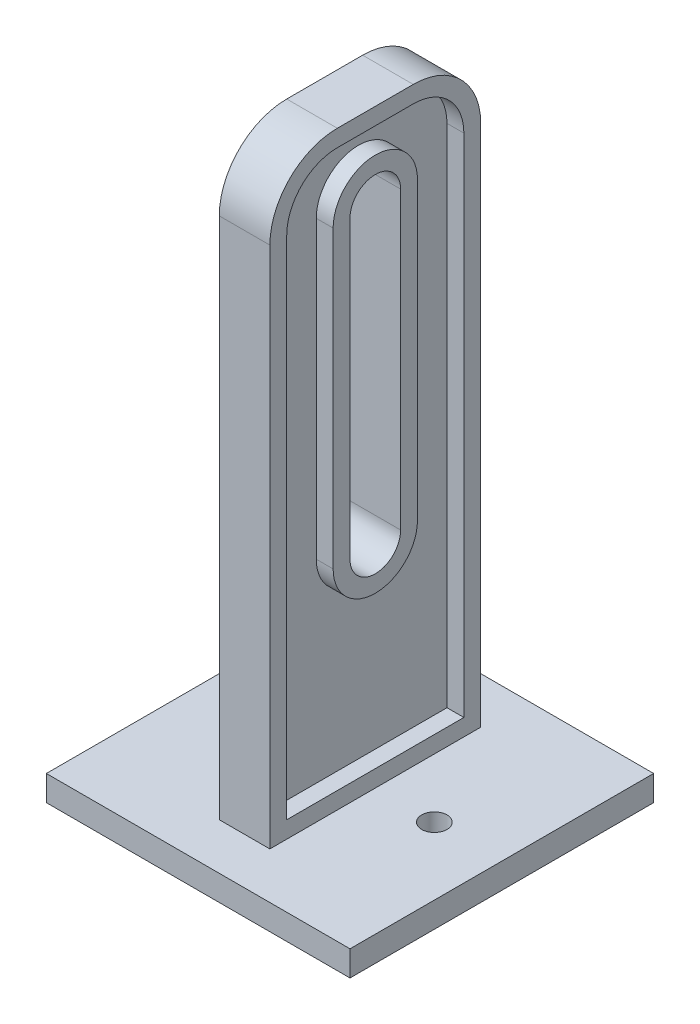
ISO-10303-21;
HEADER;
FILE_DESCRIPTION(('STEP AP214'),'2;1');
FILE_NAME('part.step','',(''),(''),'','','');
FILE_SCHEMA(('AUTOMOTIVE_DESIGN { 1 0 10303 214 1 1 1 1 }'));
ENDSEC;
DATA;
#1=APPLICATION_CONTEXT('core data for automotive mechanical design processes');
#2=APPLICATION_PROTOCOL_DEFINITION('international standard','automotive_design',2000,#1);
#3=PRODUCT_CONTEXT('',#1,'mechanical');
#4=PRODUCT('Part','Part','',(#3));
#5=PRODUCT_RELATED_PRODUCT_CATEGORY('part','',(#4));
#6=PRODUCT_DEFINITION_FORMATION('','',#4);
#7=PRODUCT_DEFINITION_CONTEXT('part definition',#1,'design');
#8=PRODUCT_DEFINITION('design','',#6,#7);
#9=PRODUCT_DEFINITION_SHAPE('','',#8);
#10=(LENGTH_UNIT() NAMED_UNIT(*) SI_UNIT(.MILLI.,.METRE.));
#11=(NAMED_UNIT(*) PLANE_ANGLE_UNIT() SI_UNIT($,.RADIAN.));
#12=(NAMED_UNIT(*) SI_UNIT($,.STERADIAN.) SOLID_ANGLE_UNIT());
#13=UNCERTAINTY_MEASURE_WITH_UNIT(LENGTH_MEASURE(1.E-05),#10,'distance_accuracy_value','');
#14=(GEOMETRIC_REPRESENTATION_CONTEXT(3) GLOBAL_UNCERTAINTY_ASSIGNED_CONTEXT((#13)) GLOBAL_UNIT_ASSIGNED_CONTEXT((#10,
#11,#12)) REPRESENTATION_CONTEXT('',''));
#15=CARTESIAN_POINT('',(0.,0.,0.));
#16=DIRECTION('',(0.,0.,1.));
#17=DIRECTION('',(1.,0.,0.));
#18=AXIS2_PLACEMENT_3D('',#15,#16,#17);
#19=CARTESIAN_POINT('',(3.,73.,12.5));
#20=DIRECTION('',(-1.,0.,0.));
#21=DIRECTION('',(0.,0.,1.));
#22=AXIS2_PLACEMENT_3D('',#19,#20,#21);
#23=PLANE('',#22);
#24=DIRECTION('',(0.,1.,0.));
#25=VECTOR('',#24,1.);
#26=CARTESIAN_POINT('',(3.,28.,-3.00000000000001));
#27=LINE('',#26,#25);
#28=CARTESIAN_POINT('',(3.,28.,-3.00000000000001));
#29=VERTEX_POINT('',#28);
#30=CARTESIAN_POINT('',(3.,63.,-3.));
#31=VERTEX_POINT('',#30);
#32=EDGE_CURVE('E319',#29,#31,#27,.T.);
#33=ORIENTED_EDGE('',*,*,#32,.F.);
#34=CARTESIAN_POINT('',(3.,28.,0.));
#35=DIRECTION('',(1.,0.,0.));
#36=DIRECTION('',(0.,0.,-1.));
#37=AXIS2_PLACEMENT_3D('',#34,#35,#36);
#38=CIRCLE('',#37,3.);
#39=CARTESIAN_POINT('',(3.,28.,2.99999999999999));
#40=VERTEX_POINT('',#39);
#41=EDGE_CURVE('E302',#40,#29,#38,.T.);
#42=ORIENTED_EDGE('',*,*,#41,.F.);
#43=DIRECTION('',(0.,-1.,0.));
#44=VECTOR('',#43,1.);
#45=CARTESIAN_POINT('',(3.,28.,2.99999999999999));
#46=LINE('',#45,#44);
#47=CARTESIAN_POINT('',(3.,63.,3.));
#48=VERTEX_POINT('',#47);
#49=EDGE_CURVE('E327',#48,#40,#46,.T.);
#50=ORIENTED_EDGE('',*,*,#49,.F.);
#51=CARTESIAN_POINT('',(3.,63.,0.));
#52=DIRECTION('',(1.,0.,0.));
#53=DIRECTION('',(0.,0.,-1.));
#54=AXIS2_PLACEMENT_3D('',#51,#52,#53);
#55=CIRCLE('',#54,3.);
#56=EDGE_CURVE('E323',#31,#48,#55,.T.);
#57=ORIENTED_EDGE('',*,*,#56,.F.);
#58=EDGE_LOOP('',(#33,#42,#50,#57));
#59=FACE_BOUND('',#58,.T.);
#60=CARTESIAN_POINT('',(3.,63.,0.));
#61=DIRECTION('',(1.,0.,0.));
#62=DIRECTION('',(0.,0.,-1.));
#63=AXIS2_PLACEMENT_3D('',#60,#61,#62);
#64=CIRCLE('',#63,5.);
#65=CARTESIAN_POINT('',(3.,63.,-5.));
#66=VERTEX_POINT('',#65);
#67=CARTESIAN_POINT('',(3.,63.,5.));
#68=VERTEX_POINT('',#67);
#69=EDGE_CURVE('E238',#66,#68,#64,.T.);
#70=ORIENTED_EDGE('',*,*,#69,.T.);
#71=DIRECTION('',(0.,-1.,0.));
#72=VECTOR('',#71,1.);
#73=CARTESIAN_POINT('',(3.,63.,5.));
#74=LINE('',#73,#72);
#75=CARTESIAN_POINT('',(3.,28.,4.99999999999999));
#76=VERTEX_POINT('',#75);
#77=EDGE_CURVE('E205',#68,#76,#74,.T.);
#78=ORIENTED_EDGE('',*,*,#77,.T.);
#79=CARTESIAN_POINT('',(3.,28.,0.));
#80=DIRECTION('',(1.,0.,0.));
#81=DIRECTION('',(0.,0.,-1.));
#82=AXIS2_PLACEMENT_3D('',#79,#80,#81);
#83=CIRCLE('',#82,5.);
#84=CARTESIAN_POINT('',(3.,28.,-5.00000000000001));
#85=VERTEX_POINT('',#84);
#86=EDGE_CURVE('E62',#76,#85,#83,.T.);
#87=ORIENTED_EDGE('',*,*,#86,.T.);
#88=DIRECTION('',(0.,1.,0.));
#89=VECTOR('',#88,1.);
#90=CARTESIAN_POINT('',(3.,28.,-5.00000000000001));
#91=LINE('',#90,#89);
#92=EDGE_CURVE('E228',#85,#66,#91,.T.);
#93=ORIENTED_EDGE('',*,*,#92,.T.);
#94=EDGE_LOOP('',(#70,#78,#87,#93));
#95=FACE_BOUND('',#94,.T.);
#96=ADVANCED_FACE('F38',(#59,#95),#23,.F.);
#97=CARTESIAN_POINT('',(0.,3.,0.));
#98=DIRECTION('',(0.,-1.,0.));
#99=DIRECTION('',(0.,0.,-1.));
#100=AXIS2_PLACEMENT_3D('',#97,#98,#99);
#101=PLANE('',#100);
#102=DIRECTION('',(0.,0.,-1.));
#103=VECTOR('',#102,1.);
#104=CARTESIAN_POINT('',(18.,3.,18.));
#105=LINE('',#104,#103);
#106=CARTESIAN_POINT('',(18.,3.,18.));
#107=VERTEX_POINT('',#106);
#108=CARTESIAN_POINT('',(18.,3.,-18.));
#109=VERTEX_POINT('',#108);
#110=EDGE_CURVE('E412',#107,#109,#105,.T.);
#111=ORIENTED_EDGE('',*,*,#110,.T.);
#112=DIRECTION('',(-1.,0.,0.));
#113=VECTOR('',#112,1.);
#114=CARTESIAN_POINT('',(-18.,3.,-18.));
#115=LINE('',#114,#113);
#116=CARTESIAN_POINT('',(-18.,3.,-18.));
#117=VERTEX_POINT('',#116);
#118=EDGE_CURVE('E416',#109,#117,#115,.T.);
#119=ORIENTED_EDGE('',*,*,#118,.T.);
#120=DIRECTION('',(0.,0.,1.));
#121=VECTOR('',#120,1.);
#122=CARTESIAN_POINT('',(-18.,3.,18.));
#123=LINE('',#122,#121);
#124=CARTESIAN_POINT('',(-18.,3.,18.));
#125=VERTEX_POINT('',#124);
#126=EDGE_CURVE('E420',#117,#125,#123,.T.);
#127=ORIENTED_EDGE('',*,*,#126,.T.);
#128=DIRECTION('',(1.,0.,0.));
#129=VECTOR('',#128,1.);
#130=CARTESIAN_POINT('',(-18.,3.,18.));
#131=LINE('',#130,#129);
#132=EDGE_CURVE('E423',#125,#107,#131,.T.);
#133=ORIENTED_EDGE('',*,*,#132,.T.);
#134=EDGE_LOOP('',(#111,#119,#127,#133));
#135=FACE_BOUND('',#134,.T.);
#136=CARTESIAN_POINT('',(-10.,3.,0.));
#137=DIRECTION('',(0.,1.,0.));
#138=DIRECTION('',(0.,0.,1.));
#139=AXIS2_PLACEMENT_3D('',#136,#137,#138);
#140=CIRCLE('',#139,1.5);
#141=CARTESIAN_POINT('',(-10.,3.,1.5));
#142=VERTEX_POINT('',#141);
#143=EDGE_CURVE('E395',#142,#142,#140,.T.);
#144=ORIENTED_EDGE('',*,*,#143,.F.);
#145=EDGE_LOOP('',(#144));
#146=FACE_BOUND('',#145,.T.);
#147=CARTESIAN_POINT('',(10.,3.,0.));
#148=DIRECTION('',(0.,1.,0.));
#149=DIRECTION('',(0.,0.,1.));
#150=AXIS2_PLACEMENT_3D('',#147,#148,#149);
#151=CIRCLE('',#150,1.5);
#152=CARTESIAN_POINT('',(10.,3.,1.5));
#153=VERTEX_POINT('',#152);
#154=EDGE_CURVE('E401',#153,#153,#151,.T.);
#155=ORIENTED_EDGE('',*,*,#154,.F.);
#156=EDGE_LOOP('',(#155));
#157=FACE_BOUND('',#156,.T.);
#158=DIRECTION('',(0.,0.,1.));
#159=VECTOR('',#158,1.);
#160=CARTESIAN_POINT('',(-3.,3.,12.5));
#161=LINE('',#160,#159);
#162=CARTESIAN_POINT('',(-3.,3.,-12.5));
#163=VERTEX_POINT('',#162);
#164=CARTESIAN_POINT('',(-3.,3.,12.5));
#165=VERTEX_POINT('',#164);
#166=EDGE_CURVE('E360',#163,#165,#161,.T.);
#167=ORIENTED_EDGE('',*,*,#166,.F.);
#168=DIRECTION('',(-1.,0.,0.));
#169=VECTOR('',#168,1.);
#170=CARTESIAN_POINT('',(3.,3.,-12.5));
#171=LINE('',#170,#169);
#172=CARTESIAN_POINT('',(3.,3.,-12.5));
#173=VERTEX_POINT('',#172);
#174=EDGE_CURVE('E366',#173,#163,#171,.T.);
#175=ORIENTED_EDGE('',*,*,#174,.F.);
#176=DIRECTION('',(0.,0.,-1.));
#177=VECTOR('',#176,1.);
#178=CARTESIAN_POINT('',(3.,3.,12.5));
#179=LINE('',#178,#177);
#180=CARTESIAN_POINT('',(3.,3.,12.5));
#181=VERTEX_POINT('',#180);
#182=EDGE_CURVE('E377',#181,#173,#179,.T.);
#183=ORIENTED_EDGE('',*,*,#182,.F.);
#184=DIRECTION('',(1.,0.,0.));
#185=VECTOR('',#184,1.);
#186=CARTESIAN_POINT('',(3.,3.,12.5));
#187=LINE('',#186,#185);
#188=EDGE_CURVE('E373',#165,#181,#187,.T.);
#189=ORIENTED_EDGE('',*,*,#188,.F.);
#190=EDGE_LOOP('',(#167,#175,#183,#189));
#191=FACE_BOUND('',#190,.T.);
#192=ADVANCED_FACE('F504',(#135,#146,#157,#191),#101,.F.);
#193=CARTESIAN_POINT('',(18.,3.,18.));
#194=DIRECTION('',(-1.,0.,0.));
#195=DIRECTION('',(0.,0.,1.));
#196=AXIS2_PLACEMENT_3D('',#193,#194,#195);
#197=PLANE('',#196);
#198=DIRECTION('',(0.,0.,-1.));
#199=VECTOR('',#198,1.);
#200=CARTESIAN_POINT('',(18.,0.,18.));
#201=LINE('',#200,#199);
#202=CARTESIAN_POINT('',(18.,0.,18.));
#203=VERTEX_POINT('',#202);
#204=CARTESIAN_POINT('',(18.,0.,-18.));
#205=VERTEX_POINT('',#204);
#206=EDGE_CURVE('E400',#203,#205,#201,.T.);
#207=ORIENTED_EDGE('',*,*,#206,.T.);
#208=DIRECTION('',(0.,-1.,0.));
#209=VECTOR('',#208,1.);
#210=CARTESIAN_POINT('',(18.,3.,-18.));
#211=LINE('',#210,#209);
#212=EDGE_CURVE('E449',#109,#205,#211,.T.);
#213=ORIENTED_EDGE('',*,*,#212,.F.);
#214=ORIENTED_EDGE('',*,*,#110,.F.);
#215=DIRECTION('',(0.,-1.,0.));
#216=VECTOR('',#215,1.);
#217=CARTESIAN_POINT('',(18.,3.,18.));
#218=LINE('',#217,#216);
#219=EDGE_CURVE('E426',#107,#203,#218,.T.);
#220=ORIENTED_EDGE('',*,*,#219,.T.);
#221=EDGE_LOOP('',(#207,#213,#214,#220));
#222=FACE_BOUND('',#221,.T.);
#223=ADVANCED_FACE('F506',(#222),#197,.F.);
#224=CARTESIAN_POINT('',(-18.,3.,-18.));
#225=DIRECTION('',(0.,0.,1.));
#226=DIRECTION('',(1.,0.,0.));
#227=AXIS2_PLACEMENT_3D('',#224,#225,#226);
#228=PLANE('',#227);
#229=DIRECTION('',(-1.,0.,0.));
#230=VECTOR('',#229,1.);
#231=CARTESIAN_POINT('',(-18.,0.,-18.));
#232=LINE('',#231,#230);
#233=CARTESIAN_POINT('',(-18.,0.,-18.));
#234=VERTEX_POINT('',#233);
#235=EDGE_CURVE('E430',#205,#234,#232,.T.);
#236=ORIENTED_EDGE('',*,*,#235,.T.);
#237=DIRECTION('',(0.,-1.,0.));
#238=VECTOR('',#237,1.);
#239=CARTESIAN_POINT('',(-18.,3.,-18.));
#240=LINE('',#239,#238);
#241=EDGE_CURVE('E445',#117,#234,#240,.T.);
#242=ORIENTED_EDGE('',*,*,#241,.F.);
#243=ORIENTED_EDGE('',*,*,#118,.F.);
#244=ORIENTED_EDGE('',*,*,#212,.T.);
#245=EDGE_LOOP('',(#236,#242,#243,#244));
#246=FACE_BOUND('',#245,.T.);
#247=ADVANCED_FACE('F512',(#246),#228,.F.);
#248=CARTESIAN_POINT('',(-18.,3.,18.));
#249=DIRECTION('',(1.,0.,0.));
#250=DIRECTION('',(0.,0.,-1.));
#251=AXIS2_PLACEMENT_3D('',#248,#249,#250);
#252=PLANE('',#251);
#253=DIRECTION('',(0.,0.,1.));
#254=VECTOR('',#253,1.);
#255=CARTESIAN_POINT('',(-18.,0.,18.));
#256=LINE('',#255,#254);
#257=CARTESIAN_POINT('',(-18.,0.,18.));
#258=VERTEX_POINT('',#257);
#259=EDGE_CURVE('E433',#234,#258,#256,.T.);
#260=ORIENTED_EDGE('',*,*,#259,.T.);
#261=DIRECTION('',(0.,-1.,0.));
#262=VECTOR('',#261,1.);
#263=CARTESIAN_POINT('',(-18.,3.,18.));
#264=LINE('',#263,#262);
#265=EDGE_CURVE('E441',#125,#258,#264,.T.);
#266=ORIENTED_EDGE('',*,*,#265,.F.);
#267=ORIENTED_EDGE('',*,*,#126,.F.);
#268=ORIENTED_EDGE('',*,*,#241,.T.);
#269=EDGE_LOOP('',(#260,#266,#267,#268));
#270=FACE_BOUND('',#269,.T.);
#271=ADVANCED_FACE('F530',(#270),#252,.F.);
#272=CARTESIAN_POINT('',(-18.,3.,18.));
#273=DIRECTION('',(0.,0.,-1.));
#274=DIRECTION('',(-1.,0.,0.));
#275=AXIS2_PLACEMENT_3D('',#272,#273,#274);
#276=PLANE('',#275);
#277=DIRECTION('',(1.,0.,0.));
#278=VECTOR('',#277,1.);
#279=CARTESIAN_POINT('',(-18.,0.,18.));
#280=LINE('',#279,#278);
#281=EDGE_CURVE('E417',#258,#203,#280,.T.);
#282=ORIENTED_EDGE('',*,*,#281,.T.);
#283=ORIENTED_EDGE('',*,*,#219,.F.);
#284=ORIENTED_EDGE('',*,*,#132,.F.);
#285=ORIENTED_EDGE('',*,*,#265,.T.);
#286=EDGE_LOOP('',(#282,#283,#284,#285));
#287=FACE_BOUND('',#286,.T.);
#288=ADVANCED_FACE('F526',(#287),#276,.F.);
#289=CARTESIAN_POINT('',(0.,0.,0.));
#290=DIRECTION('',(0.,-1.,0.));
#291=DIRECTION('',(0.,0.,-1.));
#292=AXIS2_PLACEMENT_3D('',#289,#290,#291);
#293=PLANE('',#292);
#294=CARTESIAN_POINT('',(10.,0.,0.));
#295=DIRECTION('',(0.,1.,0.));
#296=DIRECTION('',(0.,0.,1.));
#297=AXIS2_PLACEMENT_3D('',#294,#295,#296);
#298=CIRCLE('',#297,1.5);
#299=CARTESIAN_POINT('',(10.,0.,1.5));
#300=VERTEX_POINT('',#299);
#301=EDGE_CURVE('E396',#300,#300,#298,.T.);
#302=ORIENTED_EDGE('',*,*,#301,.T.);
#303=EDGE_LOOP('',(#302));
#304=FACE_BOUND('',#303,.T.);
#305=CARTESIAN_POINT('',(-10.,0.,0.));
#306=DIRECTION('',(0.,1.,0.));
#307=DIRECTION('',(0.,0.,1.));
#308=AXIS2_PLACEMENT_3D('',#305,#306,#307);
#309=CIRCLE('',#308,1.5);
#310=CARTESIAN_POINT('',(-10.,0.,1.5));
#311=VERTEX_POINT('',#310);
#312=EDGE_CURVE('E405',#311,#311,#309,.T.);
#313=ORIENTED_EDGE('',*,*,#312,.T.);
#314=EDGE_LOOP('',(#313));
#315=FACE_BOUND('',#314,.T.);
#316=ORIENTED_EDGE('',*,*,#206,.F.);
#317=ORIENTED_EDGE('',*,*,#281,.F.);
#318=ORIENTED_EDGE('',*,*,#259,.F.);
#319=ORIENTED_EDGE('',*,*,#235,.F.);
#320=EDGE_LOOP('',(#316,#317,#318,#319));
#321=FACE_BOUND('',#320,.T.);
#322=ADVANCED_FACE('F523',(#304,#315,#321),#293,.T.);
#323=CARTESIAN_POINT('',(-10.,0.,0.));
#324=DIRECTION('',(0.,1.,0.));
#325=DIRECTION('',(0.,0.,1.));
#326=AXIS2_PLACEMENT_3D('',#323,#324,#325);
#327=CYLINDRICAL_SURFACE('',#326,1.5);
#328=ORIENTED_EDGE('',*,*,#312,.F.);
#329=EDGE_LOOP('',(#328));
#330=FACE_BOUND('',#329,.T.);
#331=ORIENTED_EDGE('',*,*,#143,.T.);
#332=EDGE_LOOP('',(#331));
#333=FACE_BOUND('',#332,.T.);
#334=ADVANCED_FACE('F521',(#330,#333),#327,.F.);
#335=CARTESIAN_POINT('',(10.,0.,0.));
#336=DIRECTION('',(0.,1.,0.));
#337=DIRECTION('',(0.,0.,1.));
#338=AXIS2_PLACEMENT_3D('',#335,#336,#337);
#339=CYLINDRICAL_SURFACE('',#338,1.5);
#340=ORIENTED_EDGE('',*,*,#301,.F.);
#341=EDGE_LOOP('',(#340));
#342=FACE_BOUND('',#341,.T.);
#343=ORIENTED_EDGE('',*,*,#154,.T.);
#344=EDGE_LOOP('',(#343));
#345=FACE_BOUND('',#344,.T.);
#346=ADVANCED_FACE('F568',(#342,#345),#339,.F.);
#347=CARTESIAN_POINT('',(-3.,73.,12.5));
#348=DIRECTION('',(1.,0.,0.));
#349=DIRECTION('',(0.,0.,-1.));
#350=AXIS2_PLACEMENT_3D('',#347,#348,#349);
#351=PLANE('',#350);
#352=DIRECTION('',(0.,-1.,0.));
#353=VECTOR('',#352,1.);
#354=CARTESIAN_POINT('',(-3.,73.,3.00000000000001));
#355=LINE('',#354,#353);
#356=CARTESIAN_POINT('',(-3.,63.,3.));
#357=VERTEX_POINT('',#356);
#358=CARTESIAN_POINT('',(-3.,28.,2.99999999999999));
#359=VERTEX_POINT('',#358);
#360=EDGE_CURVE('E352',#357,#359,#355,.T.);
#361=ORIENTED_EDGE('',*,*,#360,.T.);
#362=CARTESIAN_POINT('',(-3.,28.,0.));
#363=DIRECTION('',(1.,0.,0.));
#364=DIRECTION('',(0.,0.,-1.));
#365=AXIS2_PLACEMENT_3D('',#362,#363,#364);
#366=CIRCLE('',#365,3.);
#367=CARTESIAN_POINT('',(-3.,28.,-3.00000000000001));
#368=VERTEX_POINT('',#367);
#369=EDGE_CURVE('E356',#359,#368,#366,.T.);
#370=ORIENTED_EDGE('',*,*,#369,.T.);
#371=DIRECTION('',(0.,1.,0.));
#372=VECTOR('',#371,1.);
#373=CARTESIAN_POINT('',(-3.,73.,-3.));
#374=LINE('',#373,#372);
#375=CARTESIAN_POINT('',(-3.,63.,-3.));
#376=VERTEX_POINT('',#375);
#377=EDGE_CURVE('E335',#368,#376,#374,.T.);
#378=ORIENTED_EDGE('',*,*,#377,.T.);
#379=CARTESIAN_POINT('',(-3.,63.,0.));
#380=DIRECTION('',(1.,0.,0.));
#381=DIRECTION('',(0.,0.,-1.));
#382=AXIS2_PLACEMENT_3D('',#379,#380,#381);
#383=CIRCLE('',#382,3.);
#384=EDGE_CURVE('E348',#376,#357,#383,.T.);
#385=ORIENTED_EDGE('',*,*,#384,.T.);
#386=EDGE_LOOP('',(#361,#370,#378,#385));
#387=FACE_BOUND('',#386,.T.);
#388=DIRECTION('',(0.,-1.,0.));
#389=VECTOR('',#388,1.);
#390=CARTESIAN_POINT('',(-3.,73.,12.5));
#391=LINE('',#390,#389);
#392=CARTESIAN_POINT('',(-3.,65.,12.5));
#393=VERTEX_POINT('',#392);
#394=EDGE_CURVE('E392',#393,#165,#391,.T.);
#395=ORIENTED_EDGE('',*,*,#394,.F.);
#396=CARTESIAN_POINT('',(-3.,65.,4.5));
#397=DIRECTION('',(1.,0.,0.));
#398=DIRECTION('',(0.,0.,-1.));
#399=AXIS2_PLACEMENT_3D('',#396,#397,#398);
#400=CIRCLE('',#399,8.);
#401=CARTESIAN_POINT('',(-3.,73.,4.5));
#402=VERTEX_POINT('',#401);
#403=EDGE_CURVE('E11',#393,#402,#400,.F.);
#404=ORIENTED_EDGE('',*,*,#403,.T.);
#405=DIRECTION('',(0.,0.,1.));
#406=VECTOR('',#405,1.);
#407=CARTESIAN_POINT('',(-3.,73.,12.5));
#408=LINE('',#407,#406);
#409=CARTESIAN_POINT('',(-3.,73.,-4.5));
#410=VERTEX_POINT('',#409);
#411=EDGE_CURVE('E361',#410,#402,#408,.T.);
#412=ORIENTED_EDGE('',*,*,#411,.F.);
#413=CARTESIAN_POINT('',(-3.,65.,-4.5));
#414=DIRECTION('',(1.,0.,0.));
#415=DIRECTION('',(0.,0.,-1.));
#416=AXIS2_PLACEMENT_3D('',#413,#414,#415);
#417=CIRCLE('',#416,8.);
#418=CARTESIAN_POINT('',(-3.,65.,-12.5));
#419=VERTEX_POINT('',#418);
#420=EDGE_CURVE('E457',#410,#419,#417,.F.);
#421=ORIENTED_EDGE('',*,*,#420,.T.);
#422=DIRECTION('',(0.,-1.,0.));
#423=VECTOR('',#422,1.);
#424=CARTESIAN_POINT('',(-3.,73.,-12.5));
#425=LINE('',#424,#423);
#426=EDGE_CURVE('E369',#419,#163,#425,.T.);
#427=ORIENTED_EDGE('',*,*,#426,.T.);
#428=ORIENTED_EDGE('',*,*,#166,.T.);
#429=EDGE_LOOP('',(#395,#404,#412,#421,#427,#428));
#430=FACE_BOUND('',#429,.T.);
#431=ADVANCED_FACE('F483',(#387,#430),#351,.F.);
#432=CARTESIAN_POINT('',(3.,73.,12.5));
#433=DIRECTION('',(0.,0.,-1.));
#434=DIRECTION('',(-1.,0.,0.));
#435=AXIS2_PLACEMENT_3D('',#432,#433,#434);
#436=PLANE('',#435);
#437=DIRECTION('',(0.,-1.,0.));
#438=VECTOR('',#437,1.);
#439=CARTESIAN_POINT('',(3.,73.,12.5));
#440=LINE('',#439,#438);
#441=CARTESIAN_POINT('',(3.,65.,12.5));
#442=VERTEX_POINT('',#441);
#443=EDGE_CURVE('E389',#442,#181,#440,.T.);
#444=ORIENTED_EDGE('',*,*,#443,.F.);
#445=DIRECTION('',(1.,0.,0.));
#446=VECTOR('',#445,1.);
#447=CARTESIAN_POINT('',(-3.,65.,12.5));
#448=LINE('',#447,#446);
#449=EDGE_CURVE('E47',#442,#393,#448,.F.);
#450=ORIENTED_EDGE('',*,*,#449,.T.);
#451=ORIENTED_EDGE('',*,*,#394,.T.);
#452=ORIENTED_EDGE('',*,*,#188,.T.);
#453=EDGE_LOOP('',(#444,#450,#451,#452));
#454=FACE_BOUND('',#453,.T.);
#455=ADVANCED_FACE('F478',(#454),#436,.F.);
#456=DIRECTION('',(0.,0.,1.));
#457=VECTOR('',#456,1.);
#458=CARTESIAN_POINT('',(3.,71.,-4.5));
#459=LINE('',#458,#457);
#460=CARTESIAN_POINT('',(3.,71.,-4.5));
#461=VERTEX_POINT('',#460);
#462=CARTESIAN_POINT('',(3.,71.,4.5));
#463=VERTEX_POINT('',#462);
#464=EDGE_CURVE('E280',#461,#463,#459,.T.);
#465=ORIENTED_EDGE('',*,*,#464,.F.);
#466=CARTESIAN_POINT('',(3.,65.,-4.5));
#467=DIRECTION('',(1.,0.,0.));
#468=DIRECTION('',(0.,0.,-1.));
#469=AXIS2_PLACEMENT_3D('',#466,#467,#468);
#470=CIRCLE('',#469,6.);
#471=CARTESIAN_POINT('',(3.,65.,-10.5));
#472=VERTEX_POINT('',#471);
#473=EDGE_CURVE('E54',#472,#461,#470,.T.);
#474=ORIENTED_EDGE('',*,*,#473,.F.);
#475=DIRECTION('',(0.,1.,0.));
#476=VECTOR('',#475,1.);
#477=CARTESIAN_POINT('',(3.,5.,-10.5));
#478=LINE('',#477,#476);
#479=CARTESIAN_POINT('',(3.,5.,-10.5));
#480=VERTEX_POINT('',#479);
#481=EDGE_CURVE('E257',#480,#472,#478,.T.);
#482=ORIENTED_EDGE('',*,*,#481,.F.);
#483=DIRECTION('',(0.,0.,-1.));
#484=VECTOR('',#483,1.);
#485=CARTESIAN_POINT('',(3.,5.,10.5));
#486=LINE('',#485,#484);
#487=CARTESIAN_POINT('',(3.,5.,10.5));
#488=VERTEX_POINT('',#487);
#489=EDGE_CURVE('E292',#488,#480,#486,.T.);
#490=ORIENTED_EDGE('',*,*,#489,.F.);
#491=DIRECTION('',(0.,-1.,0.));
#492=VECTOR('',#491,1.);
#493=CARTESIAN_POINT('',(3.,65.,10.5));
#494=LINE('',#493,#492);
#495=CARTESIAN_POINT('',(3.,65.,10.5));
#496=VERTEX_POINT('',#495);
#497=EDGE_CURVE('E288',#496,#488,#494,.T.);
#498=ORIENTED_EDGE('',*,*,#497,.F.);
#499=CARTESIAN_POINT('',(3.,65.,4.5));
#500=DIRECTION('',(1.,0.,0.));
#501=DIRECTION('',(0.,0.,-1.));
#502=AXIS2_PLACEMENT_3D('',#499,#500,#501);
#503=CIRCLE('',#502,6.);
#504=EDGE_CURVE('E284',#463,#496,#503,.T.);
#505=ORIENTED_EDGE('',*,*,#504,.F.);
#506=EDGE_LOOP('',(#465,#474,#482,#490,#498,#505));
#507=FACE_BOUND('',#506,.T.);
#508=DIRECTION('',(0.,0.,-1.));
#509=VECTOR('',#508,1.);
#510=CARTESIAN_POINT('',(3.,73.,12.5));
#511=LINE('',#510,#509);
#512=CARTESIAN_POINT('',(3.,73.,4.5));
#513=VERTEX_POINT('',#512);
#514=CARTESIAN_POINT('',(3.,73.,-4.5));
#515=VERTEX_POINT('',#514);
#516=EDGE_CURVE('E365',#513,#515,#511,.T.);
#517=ORIENTED_EDGE('',*,*,#516,.F.);
#518=CARTESIAN_POINT('',(3.,65.,4.5));
#519=DIRECTION('',(-1.,0.,0.));
#520=DIRECTION('',(0.,0.,1.));
#521=AXIS2_PLACEMENT_3D('',#518,#519,#520);
#522=CIRCLE('',#521,8.);
#523=EDGE_CURVE('E471',#513,#442,#522,.F.);
#524=ORIENTED_EDGE('',*,*,#523,.T.);
#525=ORIENTED_EDGE('',*,*,#443,.T.);
#526=ORIENTED_EDGE('',*,*,#182,.T.);
#527=DIRECTION('',(0.,-1.,0.));
#528=VECTOR('',#527,1.);
#529=CARTESIAN_POINT('',(3.,73.,-12.5));
#530=LINE('',#529,#528);
#531=CARTESIAN_POINT('',(3.,65.,-12.5));
#532=VERTEX_POINT('',#531);
#533=EDGE_CURVE('E386',#532,#173,#530,.T.);
#534=ORIENTED_EDGE('',*,*,#533,.F.);
#535=CARTESIAN_POINT('',(3.,65.,-4.5));
#536=DIRECTION('',(-1.,0.,0.));
#537=DIRECTION('',(0.,0.,1.));
#538=AXIS2_PLACEMENT_3D('',#535,#536,#537);
#539=CIRCLE('',#538,8.);
#540=EDGE_CURVE('E463',#532,#515,#539,.F.);
#541=ORIENTED_EDGE('',*,*,#540,.T.);
#542=EDGE_LOOP('',(#517,#524,#525,#526,#534,#541));
#543=FACE_BOUND('',#542,.T.);
#544=ADVANCED_FACE('F491',(#507,#543),#23,.F.);
#545=CARTESIAN_POINT('',(3.,73.,-12.5));
#546=DIRECTION('',(0.,0.,1.));
#547=DIRECTION('',(1.,0.,0.));
#548=AXIS2_PLACEMENT_3D('',#545,#546,#547);
#549=PLANE('',#548);
#550=ORIENTED_EDGE('',*,*,#426,.F.);
#551=DIRECTION('',(-1.,0.,0.));
#552=VECTOR('',#551,1.);
#553=CARTESIAN_POINT('',(3.,65.,-12.5));
#554=LINE('',#553,#552);
#555=EDGE_CURVE('E460',#419,#532,#554,.F.);
#556=ORIENTED_EDGE('',*,*,#555,.T.);
#557=ORIENTED_EDGE('',*,*,#533,.T.);
#558=ORIENTED_EDGE('',*,*,#174,.T.);
#559=EDGE_LOOP('',(#550,#556,#557,#558));
#560=FACE_BOUND('',#559,.T.);
#561=ADVANCED_FACE('F500',(#560),#549,.F.);
#562=CARTESIAN_POINT('',(0.,73.,0.));
#563=DIRECTION('',(0.,1.,0.));
#564=DIRECTION('',(0.,0.,1.));
#565=AXIS2_PLACEMENT_3D('',#562,#563,#564);
#566=PLANE('',#565);
#567=ORIENTED_EDGE('',*,*,#411,.T.);
#568=DIRECTION('',(1.,0.,0.));
#569=VECTOR('',#568,1.);
#570=CARTESIAN_POINT('',(3.,73.,4.5));
#571=LINE('',#570,#569);
#572=EDGE_CURVE('E467',#402,#513,#571,.T.);
#573=ORIENTED_EDGE('',*,*,#572,.T.);
#574=ORIENTED_EDGE('',*,*,#516,.T.);
#575=DIRECTION('',(-1.,0.,0.));
#576=VECTOR('',#575,1.);
#577=CARTESIAN_POINT('',(-3.,73.,-4.5));
#578=LINE('',#577,#576);
#579=EDGE_CURVE('E453',#515,#410,#578,.T.);
#580=ORIENTED_EDGE('',*,*,#579,.T.);
#581=EDGE_LOOP('',(#567,#573,#574,#580));
#582=FACE_BOUND('',#581,.T.);
#583=ADVANCED_FACE('F489',(#582),#566,.T.);
#584=CARTESIAN_POINT('',(-67.,28.,0.));
#585=DIRECTION('',(1.,0.,0.));
#586=DIRECTION('',(0.,0.,-1.));
#587=AXIS2_PLACEMENT_3D('',#584,#585,#586);
#588=CYLINDRICAL_SURFACE('',#587,3.);
#589=DIRECTION('',(1.,0.,0.));
#590=VECTOR('',#589,1.);
#591=CARTESIAN_POINT('',(-67.,28.,2.99999999999999));
#592=LINE('',#591,#590);
#593=EDGE_CURVE('E332',#359,#40,#592,.T.);
#594=ORIENTED_EDGE('',*,*,#593,.T.);
#595=ORIENTED_EDGE('',*,*,#41,.T.);
#596=DIRECTION('',(1.,0.,0.));
#597=VECTOR('',#596,1.);
#598=CARTESIAN_POINT('',(-67.,28.,-3.00000000000001));
#599=LINE('',#598,#597);
#600=EDGE_CURVE('E331',#368,#29,#599,.T.);
#601=ORIENTED_EDGE('',*,*,#600,.F.);
#602=ORIENTED_EDGE('',*,*,#369,.F.);
#603=EDGE_LOOP('',(#594,#595,#601,#602));
#604=FACE_BOUND('',#603,.T.);
#605=ADVANCED_FACE('F555',(#604),#588,.F.);
#606=CARTESIAN_POINT('',(-67.,28.,2.99999999999999));
#607=DIRECTION('',(0.,0.,1.));
#608=DIRECTION('',(0.,-1.,0.));
#609=AXIS2_PLACEMENT_3D('',#606,#607,#608);
#610=PLANE('',#609);
#611=DIRECTION('',(1.,0.,0.));
#612=VECTOR('',#611,1.);
#613=CARTESIAN_POINT('',(-67.,63.,3.));
#614=LINE('',#613,#612);
#615=EDGE_CURVE('E336',#357,#48,#614,.T.);
#616=ORIENTED_EDGE('',*,*,#615,.T.);
#617=ORIENTED_EDGE('',*,*,#49,.T.);
#618=ORIENTED_EDGE('',*,*,#593,.F.);
#619=ORIENTED_EDGE('',*,*,#360,.F.);
#620=EDGE_LOOP('',(#616,#617,#618,#619));
#621=FACE_BOUND('',#620,.T.);
#622=ADVANCED_FACE('F550',(#621),#610,.F.);
#623=CARTESIAN_POINT('',(-67.,63.,0.));
#624=DIRECTION('',(1.,0.,0.));
#625=DIRECTION('',(0.,0.,-1.));
#626=AXIS2_PLACEMENT_3D('',#623,#624,#625);
#627=CYLINDRICAL_SURFACE('',#626,3.);
#628=DIRECTION('',(1.,0.,0.));
#629=VECTOR('',#628,1.);
#630=CARTESIAN_POINT('',(-67.,63.,-3.));
#631=LINE('',#630,#629);
#632=EDGE_CURVE('E339',#376,#31,#631,.T.);
#633=ORIENTED_EDGE('',*,*,#632,.T.);
#634=ORIENTED_EDGE('',*,*,#56,.T.);
#635=ORIENTED_EDGE('',*,*,#615,.F.);
#636=ORIENTED_EDGE('',*,*,#384,.F.);
#637=EDGE_LOOP('',(#633,#634,#635,#636));
#638=FACE_BOUND('',#637,.T.);
#639=ADVANCED_FACE('F544',(#638),#627,.F.);
#640=CARTESIAN_POINT('',(-67.,28.,-3.00000000000001));
#641=DIRECTION('',(0.,0.,-1.));
#642=DIRECTION('',(0.,1.,0.));
#643=AXIS2_PLACEMENT_3D('',#640,#641,#642);
#644=PLANE('',#643);
#645=ORIENTED_EDGE('',*,*,#600,.T.);
#646=ORIENTED_EDGE('',*,*,#32,.T.);
#647=ORIENTED_EDGE('',*,*,#632,.F.);
#648=ORIENTED_EDGE('',*,*,#377,.F.);
#649=EDGE_LOOP('',(#645,#646,#647,#648));
#650=FACE_BOUND('',#649,.T.);
#651=ADVANCED_FACE('F538',(#650),#644,.F.);
#652=CARTESIAN_POINT('',(0.,65.,-4.5));
#653=DIRECTION('',(1.,0.,0.));
#654=DIRECTION('',(0.,0.,-1.));
#655=AXIS2_PLACEMENT_3D('',#652,#653,#654);
#656=CYLINDRICAL_SURFACE('',#655,8.);
#657=ORIENTED_EDGE('',*,*,#540,.F.);
#658=ORIENTED_EDGE('',*,*,#555,.F.);
#659=ORIENTED_EDGE('',*,*,#420,.F.);
#660=ORIENTED_EDGE('',*,*,#579,.F.);
#661=EDGE_LOOP('',(#657,#658,#659,#660));
#662=FACE_BOUND('',#661,.T.);
#663=ADVANCED_FACE('F497',(#662),#656,.T.);
#664=CARTESIAN_POINT('',(0.,65.,4.5));
#665=DIRECTION('',(-1.,0.,0.));
#666=DIRECTION('',(0.,0.,1.));
#667=AXIS2_PLACEMENT_3D('',#664,#665,#666);
#668=CYLINDRICAL_SURFACE('',#667,8.);
#669=ORIENTED_EDGE('',*,*,#403,.F.);
#670=ORIENTED_EDGE('',*,*,#449,.F.);
#671=ORIENTED_EDGE('',*,*,#523,.F.);
#672=ORIENTED_EDGE('',*,*,#572,.F.);
#673=EDGE_LOOP('',(#669,#670,#671,#672));
#674=FACE_BOUND('',#673,.T.);
#675=ADVANCED_FACE('F40',(#674),#668,.T.);
#676=CARTESIAN_POINT('',(1.,65.,-4.5));
#677=DIRECTION('',(1.,0.,0.));
#678=DIRECTION('',(0.,0.,-1.));
#679=AXIS2_PLACEMENT_3D('',#676,#677,#678);
#680=CYLINDRICAL_SURFACE('',#679,6.);
#681=ORIENTED_EDGE('',*,*,#473,.T.);
#682=DIRECTION('',(1.,0.,0.));
#683=VECTOR('',#682,1.);
#684=CARTESIAN_POINT('',(1.,71.,-4.5));
#685=LINE('',#684,#683);
#686=CARTESIAN_POINT('',(1.,71.,-4.5));
#687=VERTEX_POINT('',#686);
#688=EDGE_CURVE('E277',#687,#461,#685,.T.);
#689=ORIENTED_EDGE('',*,*,#688,.F.);
#690=CARTESIAN_POINT('',(1.,65.,-4.5));
#691=DIRECTION('',(1.,0.,0.));
#692=DIRECTION('',(0.,0.,-1.));
#693=AXIS2_PLACEMENT_3D('',#690,#691,#692);
#694=CIRCLE('',#693,6.);
#695=CARTESIAN_POINT('',(1.,65.,-10.5));
#696=VERTEX_POINT('',#695);
#697=EDGE_CURVE('E252',#696,#687,#694,.T.);
#698=ORIENTED_EDGE('',*,*,#697,.F.);
#699=DIRECTION('',(1.,0.,0.));
#700=VECTOR('',#699,1.);
#701=CARTESIAN_POINT('',(1.,65.,-10.5));
#702=LINE('',#701,#700);
#703=EDGE_CURVE('E299',#696,#472,#702,.T.);
#704=ORIENTED_EDGE('',*,*,#703,.T.);
#705=EDGE_LOOP('',(#681,#689,#698,#704));
#706=FACE_BOUND('',#705,.T.);
#707=ADVANCED_FACE('F543',(#706),#680,.F.);
#708=CARTESIAN_POINT('',(1.,5.,-10.5));
#709=DIRECTION('',(0.,0.,-1.));
#710=DIRECTION('',(-1.,0.,0.));
#711=AXIS2_PLACEMENT_3D('',#708,#709,#710);
#712=PLANE('',#711);
#713=ORIENTED_EDGE('',*,*,#481,.T.);
#714=ORIENTED_EDGE('',*,*,#703,.F.);
#715=DIRECTION('',(0.,1.,0.));
#716=VECTOR('',#715,1.);
#717=CARTESIAN_POINT('',(1.,5.,-10.5));
#718=LINE('',#717,#716);
#719=CARTESIAN_POINT('',(1.,5.,-10.5));
#720=VERTEX_POINT('',#719);
#721=EDGE_CURVE('E273',#720,#696,#718,.T.);
#722=ORIENTED_EDGE('',*,*,#721,.F.);
#723=DIRECTION('',(1.,0.,0.));
#724=VECTOR('',#723,1.);
#725=CARTESIAN_POINT('',(1.,5.,-10.5));
#726=LINE('',#725,#724);
#727=EDGE_CURVE('E303',#720,#480,#726,.T.);
#728=ORIENTED_EDGE('',*,*,#727,.T.);
#729=EDGE_LOOP('',(#713,#714,#722,#728));
#730=FACE_BOUND('',#729,.T.);
#731=ADVANCED_FACE('F706',(#730),#712,.F.);
#732=CARTESIAN_POINT('',(1.,5.,10.5));
#733=DIRECTION('',(0.,-1.,0.));
#734=DIRECTION('',(0.,0.,-1.));
#735=AXIS2_PLACEMENT_3D('',#732,#733,#734);
#736=PLANE('',#735);
#737=ORIENTED_EDGE('',*,*,#489,.T.);
#738=ORIENTED_EDGE('',*,*,#727,.F.);
#739=DIRECTION('',(0.,0.,-1.));
#740=VECTOR('',#739,1.);
#741=CARTESIAN_POINT('',(1.,5.,10.5));
#742=LINE('',#741,#740);
#743=CARTESIAN_POINT('',(1.,5.,10.5));
#744=VERTEX_POINT('',#743);
#745=EDGE_CURVE('E269',#744,#720,#742,.T.);
#746=ORIENTED_EDGE('',*,*,#745,.F.);
#747=DIRECTION('',(1.,0.,0.));
#748=VECTOR('',#747,1.);
#749=CARTESIAN_POINT('',(1.,5.,10.5));
#750=LINE('',#749,#748);
#751=EDGE_CURVE('E306',#744,#488,#750,.T.);
#752=ORIENTED_EDGE('',*,*,#751,.T.);
#753=EDGE_LOOP('',(#737,#738,#746,#752));
#754=FACE_BOUND('',#753,.T.);
#755=ADVANCED_FACE('F714',(#754),#736,.F.);
#756=CARTESIAN_POINT('',(1.,65.,10.5));
#757=DIRECTION('',(0.,0.,1.));
#758=DIRECTION('',(0.,-1.,0.));
#759=AXIS2_PLACEMENT_3D('',#756,#757,#758);
#760=PLANE('',#759);
#761=ORIENTED_EDGE('',*,*,#497,.T.);
#762=ORIENTED_EDGE('',*,*,#751,.F.);
#763=DIRECTION('',(0.,-1.,0.));
#764=VECTOR('',#763,1.);
#765=CARTESIAN_POINT('',(1.,65.,10.5));
#766=LINE('',#765,#764);
#767=CARTESIAN_POINT('',(1.,65.,10.5));
#768=VERTEX_POINT('',#767);
#769=EDGE_CURVE('E265',#768,#744,#766,.T.);
#770=ORIENTED_EDGE('',*,*,#769,.F.);
#771=DIRECTION('',(1.,0.,0.));
#772=VECTOR('',#771,1.);
#773=CARTESIAN_POINT('',(1.,65.,10.5));
#774=LINE('',#773,#772);
#775=EDGE_CURVE('E309',#768,#496,#774,.T.);
#776=ORIENTED_EDGE('',*,*,#775,.T.);
#777=EDGE_LOOP('',(#761,#762,#770,#776));
#778=FACE_BOUND('',#777,.T.);
#779=ADVANCED_FACE('F723',(#778),#760,.F.);
#780=CARTESIAN_POINT('',(1.,65.,4.5));
#781=DIRECTION('',(1.,0.,0.));
#782=DIRECTION('',(0.,0.,-1.));
#783=AXIS2_PLACEMENT_3D('',#780,#781,#782);
#784=CYLINDRICAL_SURFACE('',#783,6.);
#785=ORIENTED_EDGE('',*,*,#504,.T.);
#786=ORIENTED_EDGE('',*,*,#775,.F.);
#787=CARTESIAN_POINT('',(1.,65.,4.5));
#788=DIRECTION('',(1.,0.,0.));
#789=DIRECTION('',(0.,0.,-1.));
#790=AXIS2_PLACEMENT_3D('',#787,#788,#789);
#791=CIRCLE('',#790,6.);
#792=CARTESIAN_POINT('',(1.,71.,4.5));
#793=VERTEX_POINT('',#792);
#794=EDGE_CURVE('E261',#793,#768,#791,.T.);
#795=ORIENTED_EDGE('',*,*,#794,.F.);
#796=DIRECTION('',(1.,0.,0.));
#797=VECTOR('',#796,1.);
#798=CARTESIAN_POINT('',(1.,71.,4.5));
#799=LINE('',#798,#797);
#800=EDGE_CURVE('E312',#793,#463,#799,.T.);
#801=ORIENTED_EDGE('',*,*,#800,.T.);
#802=EDGE_LOOP('',(#785,#786,#795,#801));
#803=FACE_BOUND('',#802,.T.);
#804=ADVANCED_FACE('F732',(#803),#784,.F.);
#805=CARTESIAN_POINT('',(1.,71.,-4.5));
#806=DIRECTION('',(0.,1.,0.));
#807=DIRECTION('',(0.,0.,1.));
#808=AXIS2_PLACEMENT_3D('',#805,#806,#807);
#809=PLANE('',#808);
#810=ORIENTED_EDGE('',*,*,#464,.T.);
#811=ORIENTED_EDGE('',*,*,#800,.F.);
#812=DIRECTION('',(0.,0.,1.));
#813=VECTOR('',#812,1.);
#814=CARTESIAN_POINT('',(1.,71.,-4.5));
#815=LINE('',#814,#813);
#816=EDGE_CURVE('E256',#687,#793,#815,.T.);
#817=ORIENTED_EDGE('',*,*,#816,.F.);
#818=ORIENTED_EDGE('',*,*,#688,.T.);
#819=EDGE_LOOP('',(#810,#811,#817,#818));
#820=FACE_BOUND('',#819,.T.);
#821=ADVANCED_FACE('F741',(#820),#809,.F.);
#822=CARTESIAN_POINT('',(1.,65.,-4.5));
#823=DIRECTION('',(1.,0.,0.));
#824=DIRECTION('',(0.,0.,-1.));
#825=AXIS2_PLACEMENT_3D('',#822,#823,#824);
#826=PLANE('',#825);
#827=DIRECTION('',(0.,1.,0.));
#828=VECTOR('',#827,1.);
#829=CARTESIAN_POINT('',(1.,28.,-5.00000000000001));
#830=LINE('',#829,#828);
#831=CARTESIAN_POINT('',(1.,28.,-5.00000000000001));
#832=VERTEX_POINT('',#831);
#833=CARTESIAN_POINT('',(1.,63.,-5.));
#834=VERTEX_POINT('',#833);
#835=EDGE_CURVE('E212',#832,#834,#830,.T.);
#836=ORIENTED_EDGE('',*,*,#835,.F.);
#837=CARTESIAN_POINT('',(1.,28.,0.));
#838=DIRECTION('',(1.,0.,0.));
#839=DIRECTION('',(0.,0.,-1.));
#840=AXIS2_PLACEMENT_3D('',#837,#838,#839);
#841=CIRCLE('',#840,5.);
#842=CARTESIAN_POINT('',(1.,28.,4.99999999999999));
#843=VERTEX_POINT('',#842);
#844=EDGE_CURVE('E222',#843,#832,#841,.T.);
#845=ORIENTED_EDGE('',*,*,#844,.F.);
#846=DIRECTION('',(0.,-1.,0.));
#847=VECTOR('',#846,1.);
#848=CARTESIAN_POINT('',(1.,63.,5.));
#849=LINE('',#848,#847);
#850=CARTESIAN_POINT('',(1.,63.,5.));
#851=VERTEX_POINT('',#850);
#852=EDGE_CURVE('E203',#851,#843,#849,.T.);
#853=ORIENTED_EDGE('',*,*,#852,.F.);
#854=CARTESIAN_POINT('',(1.,63.,0.));
#855=DIRECTION('',(1.,0.,0.));
#856=DIRECTION('',(0.,0.,-1.));
#857=AXIS2_PLACEMENT_3D('',#854,#855,#856);
#858=CIRCLE('',#857,5.);
#859=EDGE_CURVE('E219',#834,#851,#858,.T.);
#860=ORIENTED_EDGE('',*,*,#859,.F.);
#861=EDGE_LOOP('',(#836,#845,#853,#860));
#862=FACE_BOUND('',#861,.T.);
#863=ORIENTED_EDGE('',*,*,#697,.T.);
#864=ORIENTED_EDGE('',*,*,#816,.T.);
#865=ORIENTED_EDGE('',*,*,#794,.T.);
#866=ORIENTED_EDGE('',*,*,#769,.T.);
#867=ORIENTED_EDGE('',*,*,#745,.T.);
#868=ORIENTED_EDGE('',*,*,#721,.T.);
#869=EDGE_LOOP('',(#863,#864,#865,#866,#867,#868));
#870=FACE_BOUND('',#869,.T.);
#871=ADVANCED_FACE('F217',(#862,#870),#826,.T.);
#872=CARTESIAN_POINT('',(1.,63.,0.));
#873=DIRECTION('',(1.,0.,0.));
#874=DIRECTION('',(0.,0.,-1.));
#875=AXIS2_PLACEMENT_3D('',#872,#873,#874);
#876=CYLINDRICAL_SURFACE('',#875,5.);
#877=ORIENTED_EDGE('',*,*,#69,.F.);
#878=DIRECTION('',(1.,0.,0.));
#879=VECTOR('',#878,1.);
#880=CARTESIAN_POINT('',(1.,63.,-5.));
#881=LINE('',#880,#879);
#882=EDGE_CURVE('E226',#834,#66,#881,.T.);
#883=ORIENTED_EDGE('',*,*,#882,.F.);
#884=ORIENTED_EDGE('',*,*,#859,.T.);
#885=DIRECTION('',(1.,0.,0.));
#886=VECTOR('',#885,1.);
#887=CARTESIAN_POINT('',(1.,63.,5.));
#888=LINE('',#887,#886);
#889=EDGE_CURVE('E200',#851,#68,#888,.T.);
#890=ORIENTED_EDGE('',*,*,#889,.T.);
#891=EDGE_LOOP('',(#877,#883,#884,#890));
#892=FACE_BOUND('',#891,.T.);
#893=ADVANCED_FACE('F225',(#892),#876,.T.);
#894=CARTESIAN_POINT('',(1.,28.,-5.00000000000001));
#895=DIRECTION('',(0.,0.,-1.));
#896=DIRECTION('',(0.,1.,0.));
#897=AXIS2_PLACEMENT_3D('',#894,#895,#896);
#898=PLANE('',#897);
#899=ORIENTED_EDGE('',*,*,#92,.F.);
#900=DIRECTION('',(1.,0.,0.));
#901=VECTOR('',#900,1.);
#902=CARTESIAN_POINT('',(1.,28.,-5.00000000000001));
#903=LINE('',#902,#901);
#904=EDGE_CURVE('E247',#832,#85,#903,.T.);
#905=ORIENTED_EDGE('',*,*,#904,.F.);
#906=ORIENTED_EDGE('',*,*,#835,.T.);
#907=ORIENTED_EDGE('',*,*,#882,.T.);
#908=EDGE_LOOP('',(#899,#905,#906,#907));
#909=FACE_BOUND('',#908,.T.);
#910=ADVANCED_FACE('F765',(#909),#898,.T.);
#911=CARTESIAN_POINT('',(1.,28.,0.));
#912=DIRECTION('',(1.,0.,0.));
#913=DIRECTION('',(0.,0.,-1.));
#914=AXIS2_PLACEMENT_3D('',#911,#912,#913);
#915=CYLINDRICAL_SURFACE('',#914,5.);
#916=ORIENTED_EDGE('',*,*,#86,.F.);
#917=DIRECTION('',(1.,0.,0.));
#918=VECTOR('',#917,1.);
#919=CARTESIAN_POINT('',(1.,28.,4.99999999999999));
#920=LINE('',#919,#918);
#921=EDGE_CURVE('E211',#843,#76,#920,.T.);
#922=ORIENTED_EDGE('',*,*,#921,.F.);
#923=ORIENTED_EDGE('',*,*,#844,.T.);
#924=ORIENTED_EDGE('',*,*,#904,.T.);
#925=EDGE_LOOP('',(#916,#922,#923,#924));
#926=FACE_BOUND('',#925,.T.);
#927=ADVANCED_FACE('F773',(#926),#915,.T.);
#928=CARTESIAN_POINT('',(1.,63.,5.));
#929=DIRECTION('',(0.,0.,1.));
#930=DIRECTION('',(0.,-1.,0.));
#931=AXIS2_PLACEMENT_3D('',#928,#929,#930);
#932=PLANE('',#931);
#933=ORIENTED_EDGE('',*,*,#77,.F.);
#934=ORIENTED_EDGE('',*,*,#889,.F.);
#935=ORIENTED_EDGE('',*,*,#852,.T.);
#936=ORIENTED_EDGE('',*,*,#921,.T.);
#937=EDGE_LOOP('',(#933,#934,#935,#936));
#938=FACE_BOUND('',#937,.T.);
#939=ADVANCED_FACE('F202',(#938),#932,.T.);
#940=CLOSED_SHELL('',(#96,#192,#223,#247,#271,#288,#322,#334,#346,#431,#455,#544,#561,#583,#605,
#622,#639,#651,#663,#675,#707,#731,#755,#779,#804,#821,#871,#893,#910,#927,#939));
#941=MANIFOLD_SOLID_BREP('B2',#940);
#942=ADVANCED_BREP_SHAPE_REPRESENTATION('',(#18,#941),#14);
#943=SHAPE_DEFINITION_REPRESENTATION(#9,#942);
ENDSEC;
END-ISO-10303-21;
